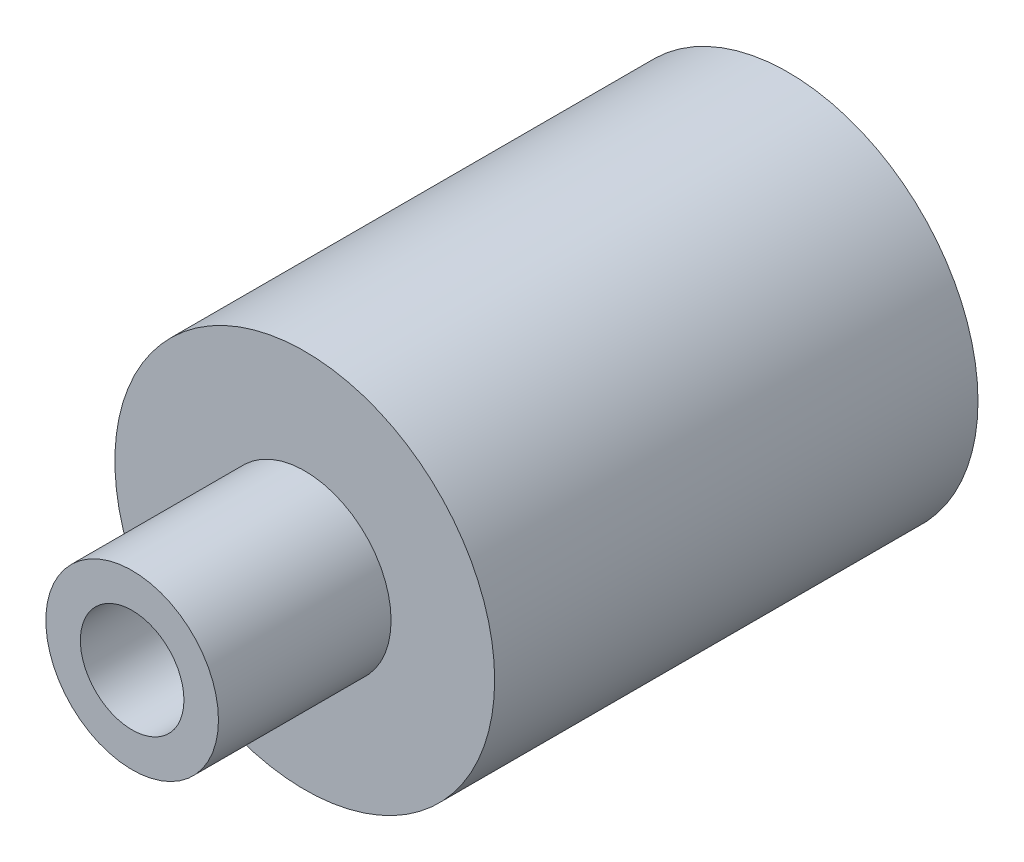
ISO-10303-21;
HEADER;
FILE_DESCRIPTION(('STEP AP214'),'2;1');
FILE_NAME('part.step','',(''),(''),'','','');
FILE_SCHEMA(('AUTOMOTIVE_DESIGN { 1 0 10303 214 1 1 1 1 }'));
ENDSEC;
DATA;
#1=APPLICATION_CONTEXT('core data for automotive mechanical design processes');
#2=APPLICATION_PROTOCOL_DEFINITION('international standard','automotive_design',2000,#1);
#3=PRODUCT_CONTEXT('',#1,'mechanical');
#4=PRODUCT('Part','Part','',(#3));
#5=PRODUCT_RELATED_PRODUCT_CATEGORY('part','',(#4));
#6=PRODUCT_DEFINITION_FORMATION('','',#4);
#7=PRODUCT_DEFINITION_CONTEXT('part definition',#1,'design');
#8=PRODUCT_DEFINITION('design','',#6,#7);
#9=PRODUCT_DEFINITION_SHAPE('','',#8);
#10=(LENGTH_UNIT() NAMED_UNIT(*) SI_UNIT(.MILLI.,.METRE.));
#11=(NAMED_UNIT(*) PLANE_ANGLE_UNIT() SI_UNIT($,.RADIAN.));
#12=(NAMED_UNIT(*) SI_UNIT($,.STERADIAN.) SOLID_ANGLE_UNIT());
#13=UNCERTAINTY_MEASURE_WITH_UNIT(LENGTH_MEASURE(1.E-05),#10,'distance_accuracy_value','');
#14=(GEOMETRIC_REPRESENTATION_CONTEXT(3) GLOBAL_UNCERTAINTY_ASSIGNED_CONTEXT((#13)) GLOBAL_UNIT_ASSIGNED_CONTEXT((#10,
#11,#12)) REPRESENTATION_CONTEXT('',''));
#15=CARTESIAN_POINT('',(0.,0.,0.));
#16=DIRECTION('',(0.,0.,1.));
#17=DIRECTION('',(1.,0.,0.));
#18=AXIS2_PLACEMENT_3D('',#15,#16,#17);
#19=CARTESIAN_POINT('',(0.,11.,-28.));
#20=DIRECTION('',(0.,0.,1.));
#21=DIRECTION('',(1.,0.,0.));
#22=AXIS2_PLACEMENT_3D('',#19,#20,#21);
#23=PLANE('',#22);
#24=CARTESIAN_POINT('',(0.,0.,-28.));
#25=DIRECTION('',(0.,0.,1.));
#26=DIRECTION('',(1.,0.,0.));
#27=AXIS2_PLACEMENT_3D('',#24,#25,#26);
#28=CIRCLE('',#27,11.);
#29=CARTESIAN_POINT('',(11.,0.,-28.));
#30=VERTEX_POINT('',#29);
#31=EDGE_CURVE('E67',#30,#30,#28,.T.);
#32=ORIENTED_EDGE('',*,*,#31,.F.);
#33=EDGE_LOOP('',(#32));
#34=FACE_BOUND('',#33,.T.);
#35=CARTESIAN_POINT('',(0.,0.,-28.));
#36=DIRECTION('',(0.,0.,1.));
#37=DIRECTION('',(1.,0.,0.));
#38=AXIS2_PLACEMENT_3D('',#35,#36,#37);
#39=CIRCLE('',#38,10.);
#40=CARTESIAN_POINT('',(10.,0.,-28.));
#41=VERTEX_POINT('',#40);
#42=EDGE_CURVE('E10',#41,#41,#39,.T.);
#43=ORIENTED_EDGE('',*,*,#42,.T.);
#44=EDGE_LOOP('',(#43));
#45=FACE_BOUND('',#44,.T.);
#46=ADVANCED_FACE('F33',(#34,#45),#23,.F.);
#47=CARTESIAN_POINT('',(0.,0.,28.642974124459));
#48=DIRECTION('',(0.,0.,1.));
#49=DIRECTION('',(1.,0.,0.));
#50=AXIS2_PLACEMENT_3D('',#47,#48,#49);
#51=CYLINDRICAL_SURFACE('',#50,10.);
#52=ORIENTED_EDGE('',*,*,#42,.F.);
#53=EDGE_LOOP('',(#52));
#54=FACE_BOUND('',#53,.T.);
#55=CARTESIAN_POINT('',(0.,0.,-23.));
#56=DIRECTION('',(0.,0.,1.));
#57=DIRECTION('',(1.,0.,0.));
#58=AXIS2_PLACEMENT_3D('',#55,#56,#57);
#59=CIRCLE('',#58,10.);
#60=CARTESIAN_POINT('',(10.,0.,-23.));
#61=VERTEX_POINT('',#60);
#62=EDGE_CURVE('E39',#61,#61,#59,.T.);
#63=ORIENTED_EDGE('',*,*,#62,.T.);
#64=EDGE_LOOP('',(#63));
#65=FACE_BOUND('',#64,.T.);
#66=ADVANCED_FACE('F74',(#54,#65),#51,.F.);
#67=CARTESIAN_POINT('',(0.,8.,-23.));
#68=DIRECTION('',(0.,0.,1.));
#69=DIRECTION('',(1.,0.,0.));
#70=AXIS2_PLACEMENT_3D('',#67,#68,#69);
#71=PLANE('',#70);
#72=ORIENTED_EDGE('',*,*,#62,.F.);
#73=EDGE_LOOP('',(#72));
#74=FACE_BOUND('',#73,.T.);
#75=CARTESIAN_POINT('',(0.,0.,-23.));
#76=DIRECTION('',(0.,0.,1.));
#77=DIRECTION('',(1.,0.,0.));
#78=AXIS2_PLACEMENT_3D('',#75,#76,#77);
#79=CIRCLE('',#78,8.);
#80=CARTESIAN_POINT('',(8.,0.,-23.));
#81=VERTEX_POINT('',#80);
#82=EDGE_CURVE('E43',#81,#81,#79,.T.);
#83=ORIENTED_EDGE('',*,*,#82,.T.);
#84=EDGE_LOOP('',(#83));
#85=FACE_BOUND('',#84,.T.);
#86=ADVANCED_FACE('F78',(#74,#85),#71,.F.);
#87=CARTESIAN_POINT('',(0.,0.,28.642974124459));
#88=DIRECTION('',(0.,0.,1.));
#89=DIRECTION('',(1.,0.,0.));
#90=AXIS2_PLACEMENT_3D('',#87,#88,#89);
#91=CYLINDRICAL_SURFACE('',#90,8.);
#92=ORIENTED_EDGE('',*,*,#82,.F.);
#93=EDGE_LOOP('',(#92));
#94=FACE_BOUND('',#93,.T.);
#95=CARTESIAN_POINT('',(0.,0.,-2.));
#96=DIRECTION('',(0.,0.,1.));
#97=DIRECTION('',(1.,0.,0.));
#98=AXIS2_PLACEMENT_3D('',#95,#96,#97);
#99=CIRCLE('',#98,8.);
#100=CARTESIAN_POINT('',(8.,0.,-2.));
#101=VERTEX_POINT('',#100);
#102=EDGE_CURVE('E47',#101,#101,#99,.T.);
#103=ORIENTED_EDGE('',*,*,#102,.T.);
#104=EDGE_LOOP('',(#103));
#105=FACE_BOUND('',#104,.T.);
#106=ADVANCED_FACE('F83',(#94,#105),#91,.F.);
#107=CARTESIAN_POINT('',(0.,8.,-2.));
#108=DIRECTION('',(0.,0.,1.));
#109=DIRECTION('',(1.,0.,0.));
#110=AXIS2_PLACEMENT_3D('',#107,#108,#109);
#111=PLANE('',#110);
#112=ORIENTED_EDGE('',*,*,#102,.F.);
#113=EDGE_LOOP('',(#112));
#114=FACE_BOUND('',#113,.T.);
#115=CARTESIAN_POINT('',(0.,0.,-2.));
#116=DIRECTION('',(0.,0.,1.));
#117=DIRECTION('',(1.,0.,0.));
#118=AXIS2_PLACEMENT_3D('',#115,#116,#117);
#119=CIRCLE('',#118,3.);
#120=CARTESIAN_POINT('',(3.,0.,-2.));
#121=VERTEX_POINT('',#120);
#122=EDGE_CURVE('E52',#121,#121,#119,.T.);
#123=ORIENTED_EDGE('',*,*,#122,.T.);
#124=EDGE_LOOP('',(#123));
#125=FACE_BOUND('',#124,.T.);
#126=ADVANCED_FACE('F89',(#114,#125),#111,.F.);
#127=CARTESIAN_POINT('',(0.,0.,28.642974124459));
#128=DIRECTION('',(0.,0.,1.));
#129=DIRECTION('',(1.,0.,0.));
#130=AXIS2_PLACEMENT_3D('',#127,#128,#129);
#131=CYLINDRICAL_SURFACE('',#130,3.);
#132=ORIENTED_EDGE('',*,*,#122,.F.);
#133=EDGE_LOOP('',(#132));
#134=FACE_BOUND('',#133,.T.);
#135=CARTESIAN_POINT('',(0.,0.,10.));
#136=DIRECTION('',(0.,0.,1.));
#137=DIRECTION('',(1.,0.,0.));
#138=AXIS2_PLACEMENT_3D('',#135,#136,#137);
#139=CIRCLE('',#138,3.);
#140=CARTESIAN_POINT('',(3.,0.,10.));
#141=VERTEX_POINT('',#140);
#142=EDGE_CURVE('E55',#141,#141,#139,.T.);
#143=ORIENTED_EDGE('',*,*,#142,.T.);
#144=EDGE_LOOP('',(#143));
#145=FACE_BOUND('',#144,.T.);
#146=ADVANCED_FACE('F93',(#134,#145),#131,.F.);
#147=CARTESIAN_POINT('',(0.,3.,10.));
#148=DIRECTION('',(0.,0.,-1.));
#149=DIRECTION('',(-1.,0.,0.));
#150=AXIS2_PLACEMENT_3D('',#147,#148,#149);
#151=PLANE('',#150);
#152=ORIENTED_EDGE('',*,*,#142,.F.);
#153=EDGE_LOOP('',(#152));
#154=FACE_BOUND('',#153,.T.);
#155=CARTESIAN_POINT('',(0.,0.,10.));
#156=DIRECTION('',(0.,0.,1.));
#157=DIRECTION('',(1.,0.,0.));
#158=AXIS2_PLACEMENT_3D('',#155,#156,#157);
#159=CIRCLE('',#158,5.);
#160=CARTESIAN_POINT('',(5.,0.,10.));
#161=VERTEX_POINT('',#160);
#162=EDGE_CURVE('E58',#161,#161,#159,.T.);
#163=ORIENTED_EDGE('',*,*,#162,.T.);
#164=EDGE_LOOP('',(#163));
#165=FACE_BOUND('',#164,.T.);
#166=ADVANCED_FACE('F97',(#154,#165),#151,.F.);
#167=CARTESIAN_POINT('',(0.,0.,28.642974124459));
#168=DIRECTION('',(0.,0.,1.));
#169=DIRECTION('',(1.,0.,0.));
#170=AXIS2_PLACEMENT_3D('',#167,#168,#169);
#171=CYLINDRICAL_SURFACE('',#170,5.);
#172=ORIENTED_EDGE('',*,*,#162,.F.);
#173=EDGE_LOOP('',(#172));
#174=FACE_BOUND('',#173,.T.);
#175=CARTESIAN_POINT('',(0.,0.,0.));
#176=DIRECTION('',(0.,0.,1.));
#177=DIRECTION('',(1.,0.,0.));
#178=AXIS2_PLACEMENT_3D('',#175,#176,#177);
#179=CIRCLE('',#178,5.);
#180=CARTESIAN_POINT('',(5.,0.,0.));
#181=VERTEX_POINT('',#180);
#182=EDGE_CURVE('E61',#181,#181,#179,.T.);
#183=ORIENTED_EDGE('',*,*,#182,.T.);
#184=EDGE_LOOP('',(#183));
#185=FACE_BOUND('',#184,.T.);
#186=ADVANCED_FACE('F101',(#174,#185),#171,.T.);
#187=CARTESIAN_POINT('',(0.,11.,0.));
#188=DIRECTION('',(0.,0.,-1.));
#189=DIRECTION('',(-1.,0.,0.));
#190=AXIS2_PLACEMENT_3D('',#187,#188,#189);
#191=PLANE('',#190);
#192=ORIENTED_EDGE('',*,*,#182,.F.);
#193=EDGE_LOOP('',(#192));
#194=FACE_BOUND('',#193,.T.);
#195=CARTESIAN_POINT('',(0.,0.,0.));
#196=DIRECTION('',(0.,0.,1.));
#197=DIRECTION('',(1.,0.,0.));
#198=AXIS2_PLACEMENT_3D('',#195,#196,#197);
#199=CIRCLE('',#198,11.);
#200=CARTESIAN_POINT('',(11.,0.,0.));
#201=VERTEX_POINT('',#200);
#202=EDGE_CURVE('E64',#201,#201,#199,.T.);
#203=ORIENTED_EDGE('',*,*,#202,.T.);
#204=EDGE_LOOP('',(#203));
#205=FACE_BOUND('',#204,.T.);
#206=ADVANCED_FACE('F105',(#194,#205),#191,.F.);
#207=CARTESIAN_POINT('',(0.,0.,28.642974124459));
#208=DIRECTION('',(0.,0.,1.));
#209=DIRECTION('',(1.,0.,0.));
#210=AXIS2_PLACEMENT_3D('',#207,#208,#209);
#211=CYLINDRICAL_SURFACE('',#210,11.);
#212=ORIENTED_EDGE('',*,*,#202,.F.);
#213=EDGE_LOOP('',(#212));
#214=FACE_BOUND('',#213,.T.);
#215=ORIENTED_EDGE('',*,*,#31,.T.);
#216=EDGE_LOOP('',(#215));
#217=FACE_BOUND('',#216,.T.);
#218=ADVANCED_FACE('F71',(#214,#217),#211,.T.);
#219=CLOSED_SHELL('',(#46,#66,#86,#106,#126,#146,#166,#186,#206,#218));
#220=MANIFOLD_SOLID_BREP('B2',#219);
#221=ADVANCED_BREP_SHAPE_REPRESENTATION('',(#18,#220),#14);
#222=SHAPE_DEFINITION_REPRESENTATION(#9,#221);
ENDSEC;
END-ISO-10303-21;
